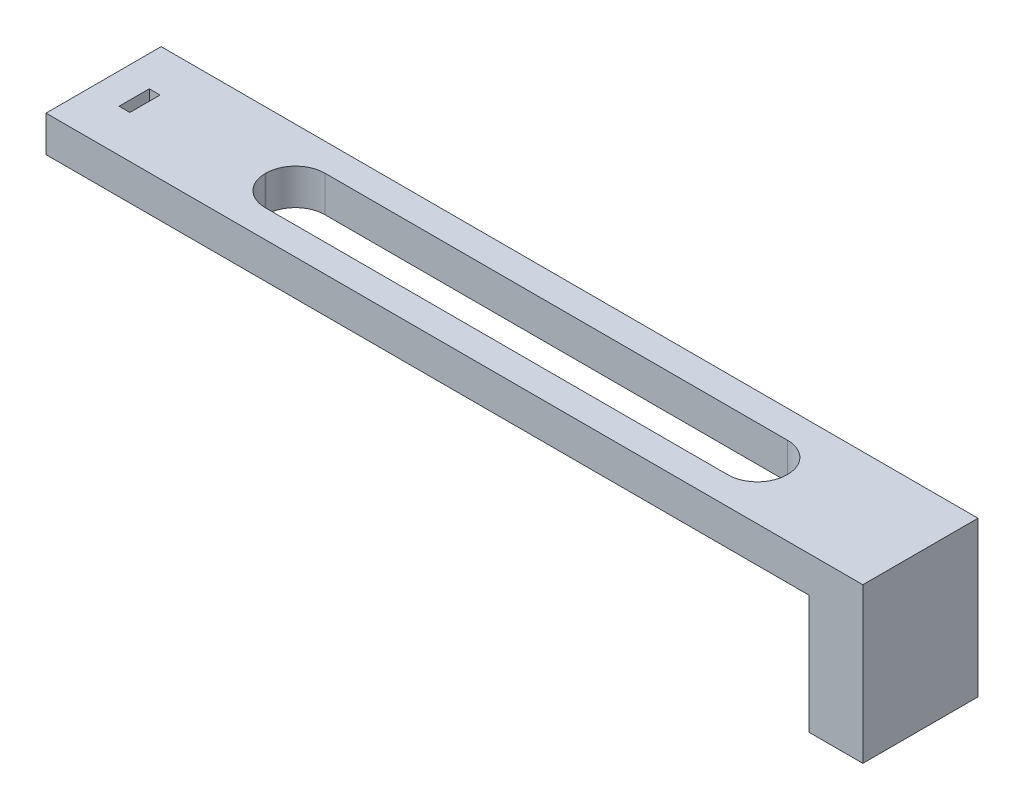
ISO-10303-21;
HEADER;
FILE_DESCRIPTION(('STEP AP214'),'2;1');
FILE_NAME('part.step','',(''),(''),'','','');
FILE_SCHEMA(('AUTOMOTIVE_DESIGN { 1 0 10303 214 1 1 1 1 }'));
ENDSEC;
DATA;
#1=APPLICATION_CONTEXT('core data for automotive mechanical design processes');
#2=APPLICATION_PROTOCOL_DEFINITION('international standard','automotive_design',2000,#1);
#3=PRODUCT_CONTEXT('',#1,'mechanical');
#4=PRODUCT('Part','Part','',(#3));
#5=PRODUCT_RELATED_PRODUCT_CATEGORY('part','',(#4));
#6=PRODUCT_DEFINITION_FORMATION('','',#4);
#7=PRODUCT_DEFINITION_CONTEXT('part definition',#1,'design');
#8=PRODUCT_DEFINITION('design','',#6,#7);
#9=PRODUCT_DEFINITION_SHAPE('','',#8);
#10=(LENGTH_UNIT() NAMED_UNIT(*) SI_UNIT(.MILLI.,.METRE.));
#11=(NAMED_UNIT(*) PLANE_ANGLE_UNIT() SI_UNIT($,.RADIAN.));
#12=(NAMED_UNIT(*) SI_UNIT($,.STERADIAN.) SOLID_ANGLE_UNIT());
#13=UNCERTAINTY_MEASURE_WITH_UNIT(LENGTH_MEASURE(1.E-05),#10,'distance_accuracy_value','');
#14=(GEOMETRIC_REPRESENTATION_CONTEXT(3) GLOBAL_UNCERTAINTY_ASSIGNED_CONTEXT((#13)) GLOBAL_UNIT_ASSIGNED_CONTEXT((#10,
#11,#12)) REPRESENTATION_CONTEXT('',''));
#15=CARTESIAN_POINT('',(0.,0.,0.));
#16=DIRECTION('',(0.,0.,1.));
#17=DIRECTION('',(1.,0.,0.));
#18=AXIS2_PLACEMENT_3D('',#15,#16,#17);
#19=CARTESIAN_POINT('',(-106.,5.,16.));
#20=DIRECTION('',(1.,0.,0.));
#21=DIRECTION('',(0.,0.,-1.));
#22=AXIS2_PLACEMENT_3D('',#19,#20,#21);
#23=PLANE('',#22);
#24=DIRECTION('',(0.,-1.,0.));
#25=VECTOR('',#24,1.);
#26=CARTESIAN_POINT('',(-106.,5.,0.));
#27=LINE('',#26,#25);
#28=CARTESIAN_POINT('',(-106.,5.,0.));
#29=VERTEX_POINT('',#28);
#30=CARTESIAN_POINT('',(-106.,0.,0.));
#31=VERTEX_POINT('',#30);
#32=EDGE_CURVE('E205',#29,#31,#27,.T.);
#33=ORIENTED_EDGE('',*,*,#32,.T.);
#34=DIRECTION('',(0.,0.,-1.));
#35=VECTOR('',#34,1.);
#36=CARTESIAN_POINT('',(-106.,0.,16.));
#37=LINE('',#36,#35);
#38=CARTESIAN_POINT('',(-106.,0.,16.));
#39=VERTEX_POINT('',#38);
#40=EDGE_CURVE('E269',#39,#31,#37,.T.);
#41=ORIENTED_EDGE('',*,*,#40,.F.);
#42=DIRECTION('',(0.,-1.,0.));
#43=VECTOR('',#42,1.);
#44=CARTESIAN_POINT('',(-106.,5.,16.));
#45=LINE('',#44,#43);
#46=CARTESIAN_POINT('',(-106.,5.,16.));
#47=VERTEX_POINT('',#46);
#48=EDGE_CURVE('E229',#47,#39,#45,.T.);
#49=ORIENTED_EDGE('',*,*,#48,.F.);
#50=DIRECTION('',(0.,0.,-1.));
#51=VECTOR('',#50,1.);
#52=CARTESIAN_POINT('',(-106.,5.,16.));
#53=LINE('',#52,#51);
#54=EDGE_CURVE('E243',#47,#29,#53,.T.);
#55=ORIENTED_EDGE('',*,*,#54,.T.);
#56=EDGE_LOOP('',(#33,#41,#49,#55));
#57=FACE_BOUND('',#56,.T.);
#58=ADVANCED_FACE('F40',(#57),#23,.F.);
#59=CARTESIAN_POINT('',(-106.,0.,16.));
#60=DIRECTION('',(0.,1.,0.));
#61=DIRECTION('',(0.,0.,1.));
#62=AXIS2_PLACEMENT_3D('',#59,#60,#61);
#63=PLANE('',#62);
#64=DIRECTION('',(-1.,0.,0.));
#65=VECTOR('',#64,1.);
#66=CARTESIAN_POINT('',(-101.75,0.,10.1));
#67=LINE('',#66,#65);
#68=CARTESIAN_POINT('',(-100.25,0.,10.1));
#69=VERTEX_POINT('',#68);
#70=CARTESIAN_POINT('',(-101.75,0.,10.1));
#71=VERTEX_POINT('',#70);
#72=EDGE_CURVE('E198',#69,#71,#67,.T.);
#73=ORIENTED_EDGE('',*,*,#72,.F.);
#74=DIRECTION('',(0.,0.,1.));
#75=VECTOR('',#74,1.);
#76=CARTESIAN_POINT('',(-100.25,0.,10.1));
#77=LINE('',#76,#75);
#78=CARTESIAN_POINT('',(-100.25,0.,5.89999999999998));
#79=VERTEX_POINT('',#78);
#80=EDGE_CURVE('E172',#79,#69,#77,.T.);
#81=ORIENTED_EDGE('',*,*,#80,.F.);
#82=DIRECTION('',(1.,0.,0.));
#83=VECTOR('',#82,1.);
#84=CARTESIAN_POINT('',(-101.75,0.,5.89999999999998));
#85=LINE('',#84,#83);
#86=CARTESIAN_POINT('',(-101.75,0.,5.89999999999998));
#87=VERTEX_POINT('',#86);
#88=EDGE_CURVE('E189',#87,#79,#85,.T.);
#89=ORIENTED_EDGE('',*,*,#88,.F.);
#90=DIRECTION('',(0.,0.,-1.));
#91=VECTOR('',#90,1.);
#92=CARTESIAN_POINT('',(-101.75,0.,10.1));
#93=LINE('',#92,#91);
#94=EDGE_CURVE('E192',#71,#87,#93,.T.);
#95=ORIENTED_EDGE('',*,*,#94,.F.);
#96=EDGE_LOOP('',(#73,#81,#89,#95));
#97=FACE_BOUND('',#96,.T.);
#98=DIRECTION('',(1.,0.,0.));
#99=VECTOR('',#98,1.);
#100=CARTESIAN_POINT('',(-11.,0.,3.85));
#101=LINE('',#100,#99);
#102=CARTESIAN_POINT('',(-79.4,0.,3.85));
#103=VERTEX_POINT('',#102);
#104=CARTESIAN_POINT('',(-15.1,0.,3.85));
#105=VERTEX_POINT('',#104);
#106=EDGE_CURVE('E221',#103,#105,#101,.T.);
#107=ORIENTED_EDGE('',*,*,#106,.F.);
#108=CARTESIAN_POINT('',(-79.4,0.,7.95));
#109=DIRECTION('',(0.,1.,0.));
#110=DIRECTION('',(0.,0.,1.));
#111=AXIS2_PLACEMENT_3D('',#108,#109,#110);
#112=CIRCLE('',#111,4.1);
#113=CARTESIAN_POINT('',(-83.5,0.,7.95));
#114=VERTEX_POINT('',#113);
#115=EDGE_CURVE('E299',#103,#114,#112,.T.);
#116=ORIENTED_EDGE('',*,*,#115,.T.);
#117=DIRECTION('',(0.,0.,-1.));
#118=VECTOR('',#117,1.);
#119=CARTESIAN_POINT('',(-83.5,0.,3.85));
#120=LINE('',#119,#118);
#121=CARTESIAN_POINT('',(-83.5,0.,8.05));
#122=VERTEX_POINT('',#121);
#123=EDGE_CURVE('E219',#122,#114,#120,.T.);
#124=ORIENTED_EDGE('',*,*,#123,.F.);
#125=CARTESIAN_POINT('',(-79.4,0.,8.05));
#126=DIRECTION('',(0.,1.,0.));
#127=DIRECTION('',(0.,0.,1.));
#128=AXIS2_PLACEMENT_3D('',#125,#126,#127);
#129=CIRCLE('',#128,4.1);
#130=CARTESIAN_POINT('',(-79.4,0.,12.15));
#131=VERTEX_POINT('',#130);
#132=EDGE_CURVE('E48',#122,#131,#129,.T.);
#133=ORIENTED_EDGE('',*,*,#132,.T.);
#134=DIRECTION('',(-1.,0.,0.));
#135=VECTOR('',#134,1.);
#136=CARTESIAN_POINT('',(-11.,0.,12.15));
#137=LINE('',#136,#135);
#138=CARTESIAN_POINT('',(-15.1,0.,12.15));
#139=VERTEX_POINT('',#138);
#140=EDGE_CURVE('E212',#139,#131,#137,.T.);
#141=ORIENTED_EDGE('',*,*,#140,.F.);
#142=CARTESIAN_POINT('',(-15.1,0.,8.05));
#143=DIRECTION('',(0.,1.,0.));
#144=DIRECTION('',(0.,0.,1.));
#145=AXIS2_PLACEMENT_3D('',#142,#143,#144);
#146=CIRCLE('',#145,4.1);
#147=CARTESIAN_POINT('',(-11.,0.,8.05));
#148=VERTEX_POINT('',#147);
#149=EDGE_CURVE('E295',#139,#148,#146,.T.);
#150=ORIENTED_EDGE('',*,*,#149,.T.);
#151=DIRECTION('',(0.,0.,1.));
#152=VECTOR('',#151,1.);
#153=CARTESIAN_POINT('',(-11.,0.,3.85));
#154=LINE('',#153,#152);
#155=CARTESIAN_POINT('',(-11.,0.,7.95));
#156=VERTEX_POINT('',#155);
#157=EDGE_CURVE('E224',#156,#148,#154,.T.);
#158=ORIENTED_EDGE('',*,*,#157,.F.);
#159=CARTESIAN_POINT('',(-15.1,0.,7.95));
#160=DIRECTION('',(0.,1.,0.));
#161=DIRECTION('',(0.,0.,1.));
#162=AXIS2_PLACEMENT_3D('',#159,#160,#161);
#163=CIRCLE('',#162,4.1);
#164=EDGE_CURVE('E291',#156,#105,#163,.T.);
#165=ORIENTED_EDGE('',*,*,#164,.T.);
#166=EDGE_LOOP('',(#107,#116,#124,#133,#141,#150,#158,#165));
#167=FACE_BOUND('',#166,.T.);
#168=DIRECTION('',(1.,0.,0.));
#169=VECTOR('',#168,1.);
#170=CARTESIAN_POINT('',(-106.,0.,0.));
#171=LINE('',#170,#169);
#172=CARTESIAN_POINT('',(0.,0.,0.));
#173=VERTEX_POINT('',#172);
#174=EDGE_CURVE('E246',#31,#173,#171,.T.);
#175=ORIENTED_EDGE('',*,*,#174,.T.);
#176=DIRECTION('',(0.,0.,-1.));
#177=VECTOR('',#176,1.);
#178=CARTESIAN_POINT('',(0.,0.,16.));
#179=LINE('',#178,#177);
#180=CARTESIAN_POINT('',(0.,0.,16.));
#181=VERTEX_POINT('',#180);
#182=EDGE_CURVE('E266',#181,#173,#179,.T.);
#183=ORIENTED_EDGE('',*,*,#182,.F.);
#184=DIRECTION('',(1.,0.,0.));
#185=VECTOR('',#184,1.);
#186=CARTESIAN_POINT('',(-106.,0.,16.));
#187=LINE('',#186,#185);
#188=EDGE_CURVE('E232',#39,#181,#187,.T.);
#189=ORIENTED_EDGE('',*,*,#188,.F.);
#190=ORIENTED_EDGE('',*,*,#40,.T.);
#191=EDGE_LOOP('',(#175,#183,#189,#190));
#192=FACE_BOUND('',#191,.T.);
#193=ADVANCED_FACE('F306',(#97,#167,#192),#63,.F.);
#194=CARTESIAN_POINT('',(0.,0.,16.));
#195=DIRECTION('',(1.,0.,0.));
#196=DIRECTION('',(0.,1.,0.));
#197=AXIS2_PLACEMENT_3D('',#194,#195,#196);
#198=PLANE('',#197);
#199=DIRECTION('',(0.,-1.,0.));
#200=VECTOR('',#199,1.);
#201=CARTESIAN_POINT('',(0.,0.,0.));
#202=LINE('',#201,#200);
#203=CARTESIAN_POINT('',(0.,-16.5,0.));
#204=VERTEX_POINT('',#203);
#205=EDGE_CURVE('E248',#173,#204,#202,.T.);
#206=ORIENTED_EDGE('',*,*,#205,.T.);
#207=DIRECTION('',(0.,0.,-1.));
#208=VECTOR('',#207,1.);
#209=CARTESIAN_POINT('',(0.,-16.5,16.));
#210=LINE('',#209,#208);
#211=CARTESIAN_POINT('',(0.,-16.5,16.));
#212=VERTEX_POINT('',#211);
#213=EDGE_CURVE('E263',#212,#204,#210,.T.);
#214=ORIENTED_EDGE('',*,*,#213,.F.);
#215=DIRECTION('',(0.,-1.,0.));
#216=VECTOR('',#215,1.);
#217=CARTESIAN_POINT('',(0.,0.,16.));
#218=LINE('',#217,#216);
#219=EDGE_CURVE('E235',#181,#212,#218,.T.);
#220=ORIENTED_EDGE('',*,*,#219,.F.);
#221=ORIENTED_EDGE('',*,*,#182,.T.);
#222=EDGE_LOOP('',(#206,#214,#220,#221));
#223=FACE_BOUND('',#222,.T.);
#224=ADVANCED_FACE('F350',(#223),#198,.F.);
#225=CARTESIAN_POINT('',(0.,-16.5,16.));
#226=DIRECTION('',(0.,1.,0.));
#227=DIRECTION('',(0.,0.,1.));
#228=AXIS2_PLACEMENT_3D('',#225,#226,#227);
#229=PLANE('',#228);
#230=DIRECTION('',(1.,0.,0.));
#231=VECTOR('',#230,1.);
#232=CARTESIAN_POINT('',(0.,-16.5,0.));
#233=LINE('',#232,#231);
#234=CARTESIAN_POINT('',(7.5,-16.5,0.));
#235=VERTEX_POINT('',#234);
#236=EDGE_CURVE('E250',#204,#235,#233,.T.);
#237=ORIENTED_EDGE('',*,*,#236,.T.);
#238=DIRECTION('',(0.,0.,-1.));
#239=VECTOR('',#238,1.);
#240=CARTESIAN_POINT('',(7.5,-16.5,16.));
#241=LINE('',#240,#239);
#242=CARTESIAN_POINT('',(7.5,-16.5,16.));
#243=VERTEX_POINT('',#242);
#244=EDGE_CURVE('E260',#243,#235,#241,.T.);
#245=ORIENTED_EDGE('',*,*,#244,.F.);
#246=DIRECTION('',(1.,0.,0.));
#247=VECTOR('',#246,1.);
#248=CARTESIAN_POINT('',(0.,-16.5,16.));
#249=LINE('',#248,#247);
#250=EDGE_CURVE('E237',#212,#243,#249,.T.);
#251=ORIENTED_EDGE('',*,*,#250,.F.);
#252=ORIENTED_EDGE('',*,*,#213,.T.);
#253=EDGE_LOOP('',(#237,#245,#251,#252));
#254=FACE_BOUND('',#253,.T.);
#255=ADVANCED_FACE('F356',(#254),#229,.F.);
#256=CARTESIAN_POINT('',(7.5,-16.5,16.));
#257=DIRECTION('',(-1.,0.,0.));
#258=DIRECTION('',(0.,0.,1.));
#259=AXIS2_PLACEMENT_3D('',#256,#257,#258);
#260=PLANE('',#259);
#261=DIRECTION('',(0.,1.,0.));
#262=VECTOR('',#261,1.);
#263=CARTESIAN_POINT('',(7.5,-16.5,0.));
#264=LINE('',#263,#262);
#265=CARTESIAN_POINT('',(7.5,5.00000000000001,0.));
#266=VERTEX_POINT('',#265);
#267=EDGE_CURVE('E252',#235,#266,#264,.T.);
#268=ORIENTED_EDGE('',*,*,#267,.T.);
#269=DIRECTION('',(0.,0.,-1.));
#270=VECTOR('',#269,1.);
#271=CARTESIAN_POINT('',(7.5,5.00000000000001,16.));
#272=LINE('',#271,#270);
#273=CARTESIAN_POINT('',(7.5,5.00000000000001,16.));
#274=VERTEX_POINT('',#273);
#275=EDGE_CURVE('E257',#274,#266,#272,.T.);
#276=ORIENTED_EDGE('',*,*,#275,.F.);
#277=DIRECTION('',(0.,1.,0.));
#278=VECTOR('',#277,1.);
#279=CARTESIAN_POINT('',(7.5,-16.5,16.));
#280=LINE('',#279,#278);
#281=EDGE_CURVE('E239',#243,#274,#280,.T.);
#282=ORIENTED_EDGE('',*,*,#281,.F.);
#283=ORIENTED_EDGE('',*,*,#244,.T.);
#284=EDGE_LOOP('',(#268,#276,#282,#283));
#285=FACE_BOUND('',#284,.T.);
#286=ADVANCED_FACE('F360',(#285),#260,.F.);
#287=CARTESIAN_POINT('',(7.5,5.00000000000001,16.));
#288=DIRECTION('',(0.,-1.,0.));
#289=DIRECTION('',(1.,0.,0.));
#290=AXIS2_PLACEMENT_3D('',#287,#288,#289);
#291=PLANE('',#290);
#292=DIRECTION('',(1.,0.,0.));
#293=VECTOR('',#292,1.);
#294=CARTESIAN_POINT('',(-101.75,5.00000000000001,5.89999999999998));
#295=LINE('',#294,#293);
#296=CARTESIAN_POINT('',(-101.75,5.00000000000001,5.89999999999998));
#297=VERTEX_POINT('',#296);
#298=CARTESIAN_POINT('',(-100.25,5.00000000000001,5.89999999999998));
#299=VERTEX_POINT('',#298);
#300=EDGE_CURVE('E177',#297,#299,#295,.T.);
#301=ORIENTED_EDGE('',*,*,#300,.T.);
#302=DIRECTION('',(0.,0.,1.));
#303=VECTOR('',#302,1.);
#304=CARTESIAN_POINT('',(-100.25,5.00000000000001,10.1));
#305=LINE('',#304,#303);
#306=CARTESIAN_POINT('',(-100.25,5.00000000000001,10.1));
#307=VERTEX_POINT('',#306);
#308=EDGE_CURVE('E169',#299,#307,#305,.T.);
#309=ORIENTED_EDGE('',*,*,#308,.T.);
#310=DIRECTION('',(-1.,0.,0.));
#311=VECTOR('',#310,1.);
#312=CARTESIAN_POINT('',(-101.75,5.00000000000001,10.1));
#313=LINE('',#312,#311);
#314=CARTESIAN_POINT('',(-101.75,5.,10.1));
#315=VERTEX_POINT('',#314);
#316=EDGE_CURVE('E181',#307,#315,#313,.T.);
#317=ORIENTED_EDGE('',*,*,#316,.T.);
#318=DIRECTION('',(0.,0.,-1.));
#319=VECTOR('',#318,1.);
#320=CARTESIAN_POINT('',(-101.75,5.00000000000001,10.1));
#321=LINE('',#320,#319);
#322=EDGE_CURVE('E185',#315,#297,#321,.T.);
#323=ORIENTED_EDGE('',*,*,#322,.T.);
#324=EDGE_LOOP('',(#301,#309,#317,#323));
#325=FACE_BOUND('',#324,.T.);
#326=DIRECTION('',(0.,0.,1.));
#327=VECTOR('',#326,1.);
#328=CARTESIAN_POINT('',(-11.,5.00000000000001,3.85));
#329=LINE('',#328,#327);
#330=CARTESIAN_POINT('',(-11.,5.00000000000001,7.95));
#331=VERTEX_POINT('',#330);
#332=CARTESIAN_POINT('',(-11.,5.00000000000001,8.05));
#333=VERTEX_POINT('',#332);
#334=EDGE_CURVE('E215',#331,#333,#329,.T.);
#335=ORIENTED_EDGE('',*,*,#334,.T.);
#336=CARTESIAN_POINT('',(-15.1,5.00000000000001,8.05));
#337=DIRECTION('',(0.,-1.,0.));
#338=DIRECTION('',(1.,0.,0.));
#339=AXIS2_PLACEMENT_3D('',#336,#337,#338);
#340=CIRCLE('',#339,4.1);
#341=CARTESIAN_POINT('',(-15.1,5.00000000000001,12.15));
#342=VERTEX_POINT('',#341);
#343=EDGE_CURVE('E297',#333,#342,#340,.T.);
#344=ORIENTED_EDGE('',*,*,#343,.T.);
#345=DIRECTION('',(-1.,0.,0.));
#346=VECTOR('',#345,1.);
#347=CARTESIAN_POINT('',(-11.,5.00000000000001,12.15));
#348=LINE('',#347,#346);
#349=CARTESIAN_POINT('',(-79.4,5.00000000000001,12.15));
#350=VERTEX_POINT('',#349);
#351=EDGE_CURVE('E199',#342,#350,#348,.T.);
#352=ORIENTED_EDGE('',*,*,#351,.T.);
#353=CARTESIAN_POINT('',(-79.4,5.,8.05));
#354=DIRECTION('',(0.,-1.,0.));
#355=DIRECTION('',(1.,0.,0.));
#356=AXIS2_PLACEMENT_3D('',#353,#354,#355);
#357=CIRCLE('',#356,4.1);
#358=CARTESIAN_POINT('',(-83.5,5.00000000000001,8.05));
#359=VERTEX_POINT('',#358);
#360=EDGE_CURVE('E11',#350,#359,#357,.T.);
#361=ORIENTED_EDGE('',*,*,#360,.T.);
#362=DIRECTION('',(0.,0.,-1.));
#363=VECTOR('',#362,1.);
#364=CARTESIAN_POINT('',(-83.5,5.00000000000001,3.85));
#365=LINE('',#364,#363);
#366=CARTESIAN_POINT('',(-83.5,5.00000000000001,7.95));
#367=VERTEX_POINT('',#366);
#368=EDGE_CURVE('E209',#359,#367,#365,.T.);
#369=ORIENTED_EDGE('',*,*,#368,.T.);
#370=CARTESIAN_POINT('',(-79.4,5.,7.95));
#371=DIRECTION('',(0.,-1.,0.));
#372=DIRECTION('',(1.,0.,0.));
#373=AXIS2_PLACEMENT_3D('',#370,#371,#372);
#374=CIRCLE('',#373,4.1);
#375=CARTESIAN_POINT('',(-79.4,5.00000000000001,3.85));
#376=VERTEX_POINT('',#375);
#377=EDGE_CURVE('E301',#367,#376,#374,.T.);
#378=ORIENTED_EDGE('',*,*,#377,.T.);
#379=DIRECTION('',(1.,0.,0.));
#380=VECTOR('',#379,1.);
#381=CARTESIAN_POINT('',(-11.,5.00000000000001,3.85));
#382=LINE('',#381,#380);
#383=CARTESIAN_POINT('',(-15.1,5.00000000000001,3.85));
#384=VERTEX_POINT('',#383);
#385=EDGE_CURVE('E211',#376,#384,#382,.T.);
#386=ORIENTED_EDGE('',*,*,#385,.T.);
#387=CARTESIAN_POINT('',(-15.1,5.00000000000001,7.95));
#388=DIRECTION('',(0.,-1.,0.));
#389=DIRECTION('',(1.,0.,0.));
#390=AXIS2_PLACEMENT_3D('',#387,#388,#389);
#391=CIRCLE('',#390,4.1);
#392=EDGE_CURVE('E293',#384,#331,#391,.T.);
#393=ORIENTED_EDGE('',*,*,#392,.T.);
#394=EDGE_LOOP('',(#335,#344,#352,#361,#369,#378,#386,#393));
#395=FACE_BOUND('',#394,.T.);
#396=DIRECTION('',(-1.,0.,0.));
#397=VECTOR('',#396,1.);
#398=CARTESIAN_POINT('',(7.5,5.00000000000001,0.));
#399=LINE('',#398,#397);
#400=EDGE_CURVE('E233',#266,#29,#399,.T.);
#401=ORIENTED_EDGE('',*,*,#400,.T.);
#402=ORIENTED_EDGE('',*,*,#54,.F.);
#403=DIRECTION('',(-1.,0.,0.));
#404=VECTOR('',#403,1.);
#405=CARTESIAN_POINT('',(7.5,5.00000000000001,16.));
#406=LINE('',#405,#404);
#407=EDGE_CURVE('E241',#274,#47,#406,.T.);
#408=ORIENTED_EDGE('',*,*,#407,.F.);
#409=ORIENTED_EDGE('',*,*,#275,.T.);
#410=EDGE_LOOP('',(#401,#402,#408,#409));
#411=FACE_BOUND('',#410,.T.);
#412=ADVANCED_FACE('F187',(#325,#395,#411),#291,.F.);
#413=CARTESIAN_POINT('',(0.,0.,16.));
#414=DIRECTION('',(0.,0.,1.));
#415=DIRECTION('',(1.,0.,0.));
#416=AXIS2_PLACEMENT_3D('',#413,#414,#415);
#417=PLANE('',#416);
#418=ORIENTED_EDGE('',*,*,#48,.T.);
#419=ORIENTED_EDGE('',*,*,#188,.T.);
#420=ORIENTED_EDGE('',*,*,#219,.T.);
#421=ORIENTED_EDGE('',*,*,#250,.T.);
#422=ORIENTED_EDGE('',*,*,#281,.T.);
#423=ORIENTED_EDGE('',*,*,#407,.T.);
#424=EDGE_LOOP('',(#418,#419,#420,#421,#422,#423));
#425=FACE_BOUND('',#424,.T.);
#426=ADVANCED_FACE('F367',(#425),#417,.T.);
#427=CARTESIAN_POINT('',(0.,0.,0.));
#428=DIRECTION('',(0.,0.,1.));
#429=DIRECTION('',(1.,0.,0.));
#430=AXIS2_PLACEMENT_3D('',#427,#428,#429);
#431=PLANE('',#430);
#432=ORIENTED_EDGE('',*,*,#32,.F.);
#433=ORIENTED_EDGE('',*,*,#400,.F.);
#434=ORIENTED_EDGE('',*,*,#267,.F.);
#435=ORIENTED_EDGE('',*,*,#236,.F.);
#436=ORIENTED_EDGE('',*,*,#205,.F.);
#437=ORIENTED_EDGE('',*,*,#174,.F.);
#438=EDGE_LOOP('',(#432,#433,#434,#435,#436,#437));
#439=FACE_BOUND('',#438,.T.);
#440=ADVANCED_FACE('F368',(#439),#431,.F.);
#441=CARTESIAN_POINT('',(-83.5,5.00000000000001,3.85));
#442=DIRECTION('',(-1.,0.,0.));
#443=DIRECTION('',(0.,0.,1.));
#444=AXIS2_PLACEMENT_3D('',#441,#442,#443);
#445=PLANE('',#444);
#446=ORIENTED_EDGE('',*,*,#123,.T.);
#447=DIRECTION('',(0.,-1.,0.));
#448=VECTOR('',#447,1.);
#449=CARTESIAN_POINT('',(-83.5,5.00000000000001,7.95));
#450=LINE('',#449,#448);
#451=EDGE_CURVE('E55',#114,#367,#450,.F.);
#452=ORIENTED_EDGE('',*,*,#451,.T.);
#453=ORIENTED_EDGE('',*,*,#368,.F.);
#454=DIRECTION('',(0.,-1.,0.));
#455=VECTOR('',#454,1.);
#456=CARTESIAN_POINT('',(-83.5,0.,8.05));
#457=LINE('',#456,#455);
#458=EDGE_CURVE('E287',#359,#122,#457,.T.);
#459=ORIENTED_EDGE('',*,*,#458,.T.);
#460=EDGE_LOOP('',(#446,#452,#453,#459));
#461=FACE_BOUND('',#460,.T.);
#462=ADVANCED_FACE('F315',(#461),#445,.F.);
#463=CARTESIAN_POINT('',(-11.,5.00000000000001,12.15));
#464=DIRECTION('',(0.,0.,1.));
#465=DIRECTION('',(1.,0.,0.));
#466=AXIS2_PLACEMENT_3D('',#463,#464,#465);
#467=PLANE('',#466);
#468=ORIENTED_EDGE('',*,*,#351,.F.);
#469=DIRECTION('',(0.,-1.,0.));
#470=VECTOR('',#469,1.);
#471=CARTESIAN_POINT('',(-15.1,0.,12.15));
#472=LINE('',#471,#470);
#473=EDGE_CURVE('E284',#342,#139,#472,.T.);
#474=ORIENTED_EDGE('',*,*,#473,.T.);
#475=ORIENTED_EDGE('',*,*,#140,.T.);
#476=DIRECTION('',(0.,-1.,0.));
#477=VECTOR('',#476,1.);
#478=CARTESIAN_POINT('',(-79.4,5.00000000000001,12.15));
#479=LINE('',#478,#477);
#480=EDGE_CURVE('E282',#131,#350,#479,.F.);
#481=ORIENTED_EDGE('',*,*,#480,.T.);
#482=EDGE_LOOP('',(#468,#474,#475,#481));
#483=FACE_BOUND('',#482,.T.);
#484=ADVANCED_FACE('F313',(#483),#467,.F.);
#485=CARTESIAN_POINT('',(-11.,5.00000000000001,3.85));
#486=DIRECTION('',(1.,0.,0.));
#487=DIRECTION('',(0.,0.,-1.));
#488=AXIS2_PLACEMENT_3D('',#485,#486,#487);
#489=PLANE('',#488);
#490=ORIENTED_EDGE('',*,*,#334,.F.);
#491=DIRECTION('',(0.,-1.,0.));
#492=VECTOR('',#491,1.);
#493=CARTESIAN_POINT('',(-11.,0.,7.95));
#494=LINE('',#493,#492);
#495=EDGE_CURVE('E274',#331,#156,#494,.T.);
#496=ORIENTED_EDGE('',*,*,#495,.T.);
#497=ORIENTED_EDGE('',*,*,#157,.T.);
#498=DIRECTION('',(0.,-1.,0.));
#499=VECTOR('',#498,1.);
#500=CARTESIAN_POINT('',(-11.,5.00000000000001,8.05));
#501=LINE('',#500,#499);
#502=EDGE_CURVE('E272',#148,#333,#501,.F.);
#503=ORIENTED_EDGE('',*,*,#502,.T.);
#504=EDGE_LOOP('',(#490,#496,#497,#503));
#505=FACE_BOUND('',#504,.T.);
#506=ADVANCED_FACE('F332',(#505),#489,.F.);
#507=CARTESIAN_POINT('',(-11.,5.00000000000001,3.85));
#508=DIRECTION('',(0.,0.,-1.));
#509=DIRECTION('',(-1.,0.,0.));
#510=AXIS2_PLACEMENT_3D('',#507,#508,#509);
#511=PLANE('',#510);
#512=ORIENTED_EDGE('',*,*,#106,.T.);
#513=DIRECTION('',(0.,-1.,0.));
#514=VECTOR('',#513,1.);
#515=CARTESIAN_POINT('',(-15.1,5.00000000000001,3.85));
#516=LINE('',#515,#514);
#517=EDGE_CURVE('E280',#105,#384,#516,.F.);
#518=ORIENTED_EDGE('',*,*,#517,.T.);
#519=ORIENTED_EDGE('',*,*,#385,.F.);
#520=DIRECTION('',(0.,-1.,0.));
#521=VECTOR('',#520,1.);
#522=CARTESIAN_POINT('',(-79.4,0.,3.85));
#523=LINE('',#522,#521);
#524=EDGE_CURVE('E277',#376,#103,#523,.T.);
#525=ORIENTED_EDGE('',*,*,#524,.T.);
#526=EDGE_LOOP('',(#512,#518,#519,#525));
#527=FACE_BOUND('',#526,.T.);
#528=ADVANCED_FACE('F323',(#527),#511,.F.);
#529=CARTESIAN_POINT('',(-100.25,5.00000000000001,10.1));
#530=DIRECTION('',(1.,0.,0.));
#531=DIRECTION('',(0.,0.,-1.));
#532=AXIS2_PLACEMENT_3D('',#529,#530,#531);
#533=PLANE('',#532);
#534=ORIENTED_EDGE('',*,*,#80,.T.);
#535=DIRECTION('',(0.,-1.,0.));
#536=VECTOR('',#535,1.);
#537=CARTESIAN_POINT('',(-100.25,5.00000000000001,10.1));
#538=LINE('',#537,#536);
#539=EDGE_CURVE('E165',#307,#69,#538,.T.);
#540=ORIENTED_EDGE('',*,*,#539,.F.);
#541=ORIENTED_EDGE('',*,*,#308,.F.);
#542=DIRECTION('',(0.,-1.,0.));
#543=VECTOR('',#542,1.);
#544=CARTESIAN_POINT('',(-100.25,5.00000000000001,5.89999999999998));
#545=LINE('',#544,#543);
#546=EDGE_CURVE('E203',#299,#79,#545,.T.);
#547=ORIENTED_EDGE('',*,*,#546,.T.);
#548=EDGE_LOOP('',(#534,#540,#541,#547));
#549=FACE_BOUND('',#548,.T.);
#550=ADVANCED_FACE('F167',(#549),#533,.F.);
#551=CARTESIAN_POINT('',(-101.75,5.00000000000001,5.89999999999998));
#552=DIRECTION('',(0.,0.,-1.));
#553=DIRECTION('',(-1.,0.,0.));
#554=AXIS2_PLACEMENT_3D('',#551,#552,#553);
#555=PLANE('',#554);
#556=ORIENTED_EDGE('',*,*,#88,.T.);
#557=ORIENTED_EDGE('',*,*,#546,.F.);
#558=ORIENTED_EDGE('',*,*,#300,.F.);
#559=DIRECTION('',(0.,-1.,0.));
#560=VECTOR('',#559,1.);
#561=CARTESIAN_POINT('',(-101.75,5.00000000000001,5.89999999999998));
#562=LINE('',#561,#560);
#563=EDGE_CURVE('E206',#297,#87,#562,.T.);
#564=ORIENTED_EDGE('',*,*,#563,.T.);
#565=EDGE_LOOP('',(#556,#557,#558,#564));
#566=FACE_BOUND('',#565,.T.);
#567=ADVANCED_FACE('F385',(#566),#555,.F.);
#568=CARTESIAN_POINT('',(-101.75,5.00000000000001,10.1));
#569=DIRECTION('',(-1.,0.,0.));
#570=DIRECTION('',(0.,0.,1.));
#571=AXIS2_PLACEMENT_3D('',#568,#569,#570);
#572=PLANE('',#571);
#573=ORIENTED_EDGE('',*,*,#94,.T.);
#574=ORIENTED_EDGE('',*,*,#563,.F.);
#575=ORIENTED_EDGE('',*,*,#322,.F.);
#576=DIRECTION('',(0.,-1.,0.));
#577=VECTOR('',#576,1.);
#578=CARTESIAN_POINT('',(-101.75,5.00000000000001,10.1));
#579=LINE('',#578,#577);
#580=EDGE_CURVE('E176',#315,#71,#579,.T.);
#581=ORIENTED_EDGE('',*,*,#580,.T.);
#582=EDGE_LOOP('',(#573,#574,#575,#581));
#583=FACE_BOUND('',#582,.T.);
#584=ADVANCED_FACE('F388',(#583),#572,.F.);
#585=CARTESIAN_POINT('',(-101.75,5.00000000000001,10.1));
#586=DIRECTION('',(0.,0.,1.));
#587=DIRECTION('',(1.,0.,0.));
#588=AXIS2_PLACEMENT_3D('',#585,#586,#587);
#589=PLANE('',#588);
#590=ORIENTED_EDGE('',*,*,#72,.T.);
#591=ORIENTED_EDGE('',*,*,#580,.F.);
#592=ORIENTED_EDGE('',*,*,#316,.F.);
#593=ORIENTED_EDGE('',*,*,#539,.T.);
#594=EDGE_LOOP('',(#590,#591,#592,#593));
#595=FACE_BOUND('',#594,.T.);
#596=ADVANCED_FACE('F182',(#595),#589,.F.);
#597=CARTESIAN_POINT('',(-15.1,5.00000000000001,7.95));
#598=DIRECTION('',(0.,1.,0.));
#599=DIRECTION('',(0.,0.,1.));
#600=AXIS2_PLACEMENT_3D('',#597,#598,#599);
#601=CYLINDRICAL_SURFACE('',#600,4.1);
#602=ORIENTED_EDGE('',*,*,#392,.F.);
#603=ORIENTED_EDGE('',*,*,#517,.F.);
#604=ORIENTED_EDGE('',*,*,#164,.F.);
#605=ORIENTED_EDGE('',*,*,#495,.F.);
#606=EDGE_LOOP('',(#602,#603,#604,#605));
#607=FACE_BOUND('',#606,.T.);
#608=ADVANCED_FACE('F329',(#607),#601,.F.);
#609=CARTESIAN_POINT('',(-15.1,5.00000000000001,8.05));
#610=DIRECTION('',(0.,1.,0.));
#611=DIRECTION('',(0.,0.,1.));
#612=AXIS2_PLACEMENT_3D('',#609,#610,#611);
#613=CYLINDRICAL_SURFACE('',#612,4.1);
#614=ORIENTED_EDGE('',*,*,#343,.F.);
#615=ORIENTED_EDGE('',*,*,#502,.F.);
#616=ORIENTED_EDGE('',*,*,#149,.F.);
#617=ORIENTED_EDGE('',*,*,#473,.F.);
#618=EDGE_LOOP('',(#614,#615,#616,#617));
#619=FACE_BOUND('',#618,.T.);
#620=ADVANCED_FACE('F336',(#619),#613,.F.);
#621=CARTESIAN_POINT('',(-79.4,5.00000000000001,7.95));
#622=DIRECTION('',(0.,1.,0.));
#623=DIRECTION('',(0.,0.,1.));
#624=AXIS2_PLACEMENT_3D('',#621,#622,#623);
#625=CYLINDRICAL_SURFACE('',#624,4.1);
#626=ORIENTED_EDGE('',*,*,#377,.F.);
#627=ORIENTED_EDGE('',*,*,#451,.F.);
#628=ORIENTED_EDGE('',*,*,#115,.F.);
#629=ORIENTED_EDGE('',*,*,#524,.F.);
#630=EDGE_LOOP('',(#626,#627,#628,#629));
#631=FACE_BOUND('',#630,.T.);
#632=ADVANCED_FACE('F321',(#631),#625,.F.);
#633=CARTESIAN_POINT('',(-79.4,5.00000000000001,8.05));
#634=DIRECTION('',(0.,1.,0.));
#635=DIRECTION('',(0.,0.,1.));
#636=AXIS2_PLACEMENT_3D('',#633,#634,#635);
#637=CYLINDRICAL_SURFACE('',#636,4.1);
#638=ORIENTED_EDGE('',*,*,#360,.F.);
#639=ORIENTED_EDGE('',*,*,#480,.F.);
#640=ORIENTED_EDGE('',*,*,#132,.F.);
#641=ORIENTED_EDGE('',*,*,#458,.F.);
#642=EDGE_LOOP('',(#638,#639,#640,#641));
#643=FACE_BOUND('',#642,.T.);
#644=ADVANCED_FACE('F42',(#643),#637,.F.);
#645=CLOSED_SHELL('',(#58,#193,#224,#255,#286,#412,#426,#440,#462,#484,#506,#528,#550,#567,#584,
#596,#608,#620,#632,#644));
#646=MANIFOLD_SOLID_BREP('B2',#645);
#647=ADVANCED_BREP_SHAPE_REPRESENTATION('',(#18,#646),#14);
#648=SHAPE_DEFINITION_REPRESENTATION(#9,#647);
ENDSEC;
END-ISO-10303-21;
